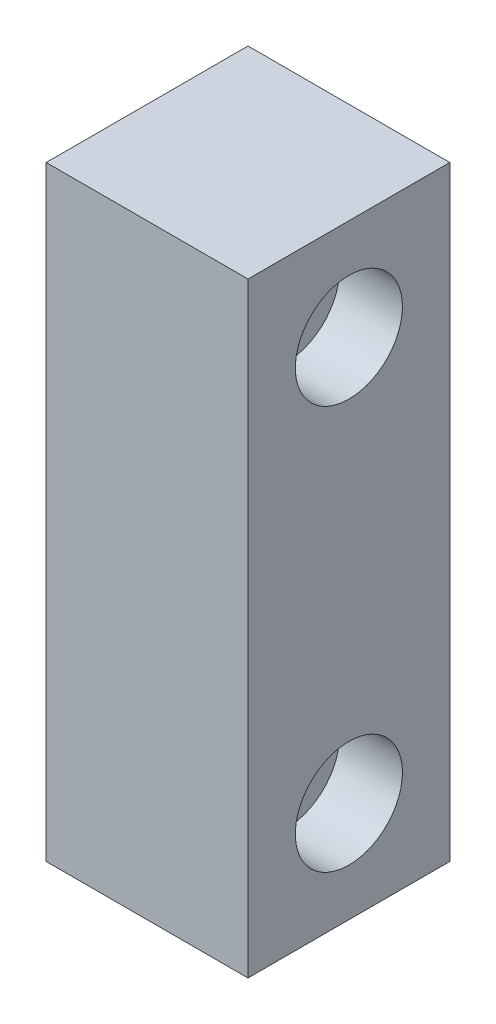
ISO-10303-21;
HEADER;
FILE_DESCRIPTION(('STEP AP214'),'2;1');
FILE_NAME('part.step','',(''),(''),'','','');
FILE_SCHEMA(('AUTOMOTIVE_DESIGN { 1 0 10303 214 1 1 1 1 }'));
ENDSEC;
DATA;
#1=APPLICATION_CONTEXT('core data for automotive mechanical design processes');
#2=APPLICATION_PROTOCOL_DEFINITION('international standard','automotive_design',2000,#1);
#3=PRODUCT_CONTEXT('',#1,'mechanical');
#4=PRODUCT('Part','Part','',(#3));
#5=PRODUCT_RELATED_PRODUCT_CATEGORY('part','',(#4));
#6=PRODUCT_DEFINITION_FORMATION('','',#4);
#7=PRODUCT_DEFINITION_CONTEXT('part definition',#1,'design');
#8=PRODUCT_DEFINITION('design','',#6,#7);
#9=PRODUCT_DEFINITION_SHAPE('','',#8);
#10=(LENGTH_UNIT() NAMED_UNIT(*) SI_UNIT(.MILLI.,.METRE.));
#11=(NAMED_UNIT(*) PLANE_ANGLE_UNIT() SI_UNIT($,.RADIAN.));
#12=(NAMED_UNIT(*) SI_UNIT($,.STERADIAN.) SOLID_ANGLE_UNIT());
#13=UNCERTAINTY_MEASURE_WITH_UNIT(LENGTH_MEASURE(1.E-05),#10,'distance_accuracy_value','');
#14=(GEOMETRIC_REPRESENTATION_CONTEXT(3) GLOBAL_UNCERTAINTY_ASSIGNED_CONTEXT((#13)) GLOBAL_UNIT_ASSIGNED_CONTEXT((#10,
#11,#12)) REPRESENTATION_CONTEXT('',''));
#15=CARTESIAN_POINT('',(0.,0.,0.));
#16=DIRECTION('',(0.,0.,1.));
#17=DIRECTION('',(1.,0.,0.));
#18=AXIS2_PLACEMENT_3D('',#15,#16,#17);
#19=CARTESIAN_POINT('',(-50.8,63.5,12.7));
#20=DIRECTION('',(1.,0.,0.));
#21=DIRECTION('',(0.,0.,-1.));
#22=AXIS2_PLACEMENT_3D('',#19,#20,#21);
#23=CYLINDRICAL_SURFACE('',#22,4.36880000000001);
#24=CARTESIAN_POINT('',(0.,63.5,12.7));
#25=DIRECTION('',(-1.,0.,0.));
#26=DIRECTION('',(0.,0.,1.));
#27=AXIS2_PLACEMENT_3D('',#24,#25,#26);
#28=CIRCLE('',#27,4.36880000000001);
#29=CARTESIAN_POINT('',(0.,63.5,17.0688));
#30=VERTEX_POINT('',#29);
#31=EDGE_CURVE('E124',#30,#30,#28,.T.);
#32=ORIENTED_EDGE('',*,*,#31,.T.);
#33=EDGE_LOOP('',(#32));
#34=FACE_BOUND('',#33,.T.);
#35=CARTESIAN_POINT('',(17.4752,63.5,12.7));
#36=DIRECTION('',(1.,0.,0.));
#37=DIRECTION('',(0.,0.,-1.));
#38=AXIS2_PLACEMENT_3D('',#35,#36,#37);
#39=CIRCLE('',#38,4.36880000000001);
#40=CARTESIAN_POINT('',(17.4752,63.5,8.33119999999999));
#41=VERTEX_POINT('',#40);
#42=EDGE_CURVE('E47',#41,#41,#39,.F.);
#43=ORIENTED_EDGE('',*,*,#42,.F.);
#44=EDGE_LOOP('',(#43));
#45=FACE_BOUND('',#44,.T.);
#46=ADVANCED_FACE('F43',(#34,#45),#23,.F.);
#47=CARTESIAN_POINT('',(-50.8,12.7,12.7));
#48=DIRECTION('',(1.,0.,0.));
#49=DIRECTION('',(0.,0.,-1.));
#50=AXIS2_PLACEMENT_3D('',#47,#48,#49);
#51=CYLINDRICAL_SURFACE('',#50,4.3688);
#52=CARTESIAN_POINT('',(0.,12.7,12.7));
#53=DIRECTION('',(-1.,0.,0.));
#54=DIRECTION('',(0.,0.,1.));
#55=AXIS2_PLACEMENT_3D('',#52,#53,#54);
#56=CIRCLE('',#55,4.3688);
#57=CARTESIAN_POINT('',(0.,12.7,17.0688));
#58=VERTEX_POINT('',#57);
#59=EDGE_CURVE('E113',#58,#58,#56,.T.);
#60=ORIENTED_EDGE('',*,*,#59,.T.);
#61=EDGE_LOOP('',(#60));
#62=FACE_BOUND('',#61,.T.);
#63=CARTESIAN_POINT('',(17.4752,12.7,12.7));
#64=DIRECTION('',(1.,0.,0.));
#65=DIRECTION('',(0.,0.,-1.));
#66=AXIS2_PLACEMENT_3D('',#63,#64,#65);
#67=CIRCLE('',#66,4.3688);
#68=CARTESIAN_POINT('',(17.4752,12.7,8.3312));
#69=VERTEX_POINT('',#68);
#70=EDGE_CURVE('E121',#69,#69,#67,.F.);
#71=ORIENTED_EDGE('',*,*,#70,.F.);
#72=EDGE_LOOP('',(#71));
#73=FACE_BOUND('',#72,.T.);
#74=ADVANCED_FACE('F172',(#62,#73),#51,.F.);
#75=CARTESIAN_POINT('',(25.4,0.,0.));
#76=DIRECTION('',(0.,1.,0.));
#77=DIRECTION('',(0.,0.,1.));
#78=AXIS2_PLACEMENT_3D('',#75,#76,#77);
#79=PLANE('',#78);
#80=DIRECTION('',(0.,0.,-1.));
#81=VECTOR('',#80,1.);
#82=CARTESIAN_POINT('',(0.,0.,0.));
#83=LINE('',#82,#81);
#84=CARTESIAN_POINT('',(0.,0.,25.4));
#85=VERTEX_POINT('',#84);
#86=CARTESIAN_POINT('',(0.,0.,0.));
#87=VERTEX_POINT('',#86);
#88=EDGE_CURVE('E110',#85,#87,#83,.T.);
#89=ORIENTED_EDGE('',*,*,#88,.T.);
#90=DIRECTION('',(-1.,0.,0.));
#91=VECTOR('',#90,1.);
#92=CARTESIAN_POINT('',(25.4,0.,0.));
#93=LINE('',#92,#91);
#94=CARTESIAN_POINT('',(25.4,0.,0.));
#95=VERTEX_POINT('',#94);
#96=EDGE_CURVE('E11',#95,#87,#93,.T.);
#97=ORIENTED_EDGE('',*,*,#96,.F.);
#98=DIRECTION('',(0.,0.,-1.));
#99=VECTOR('',#98,1.);
#100=CARTESIAN_POINT('',(25.4,0.,0.));
#101=LINE('',#100,#99);
#102=CARTESIAN_POINT('',(25.4,0.,25.4));
#103=VERTEX_POINT('',#102);
#104=EDGE_CURVE('E97',#103,#95,#101,.T.);
#105=ORIENTED_EDGE('',*,*,#104,.F.);
#106=DIRECTION('',(-1.,0.,0.));
#107=VECTOR('',#106,1.);
#108=CARTESIAN_POINT('',(25.4,0.,25.4));
#109=LINE('',#108,#107);
#110=EDGE_CURVE('E106',#103,#85,#109,.T.);
#111=ORIENTED_EDGE('',*,*,#110,.T.);
#112=EDGE_LOOP('',(#89,#97,#105,#111));
#113=FACE_BOUND('',#112,.T.);
#114=ADVANCED_FACE('F45',(#113),#79,.F.);
#115=CARTESIAN_POINT('',(25.4,0.,0.));
#116=DIRECTION('',(0.,0.,1.));
#117=DIRECTION('',(1.,0.,0.));
#118=AXIS2_PLACEMENT_3D('',#115,#116,#117);
#119=PLANE('',#118);
#120=DIRECTION('',(0.,1.,0.));
#121=VECTOR('',#120,1.);
#122=CARTESIAN_POINT('',(0.,0.,0.));
#123=LINE('',#122,#121);
#124=CARTESIAN_POINT('',(0.,76.2,0.));
#125=VERTEX_POINT('',#124);
#126=EDGE_CURVE('E101',#87,#125,#123,.T.);
#127=ORIENTED_EDGE('',*,*,#126,.T.);
#128=DIRECTION('',(-1.,0.,0.));
#129=VECTOR('',#128,1.);
#130=CARTESIAN_POINT('',(25.4,76.2,0.));
#131=LINE('',#130,#129);
#132=CARTESIAN_POINT('',(25.4,76.2,0.));
#133=VERTEX_POINT('',#132);
#134=EDGE_CURVE('E53',#133,#125,#131,.T.);
#135=ORIENTED_EDGE('',*,*,#134,.F.);
#136=DIRECTION('',(0.,1.,0.));
#137=VECTOR('',#136,1.);
#138=CARTESIAN_POINT('',(25.4,0.,0.));
#139=LINE('',#138,#137);
#140=EDGE_CURVE('E92',#95,#133,#139,.T.);
#141=ORIENTED_EDGE('',*,*,#140,.F.);
#142=ORIENTED_EDGE('',*,*,#96,.T.);
#143=EDGE_LOOP('',(#127,#135,#141,#142));
#144=FACE_BOUND('',#143,.T.);
#145=ADVANCED_FACE('F100',(#144),#119,.F.);
#146=CARTESIAN_POINT('',(25.4,76.2,0.));
#147=DIRECTION('',(0.,-1.,0.));
#148=DIRECTION('',(0.,0.,-1.));
#149=AXIS2_PLACEMENT_3D('',#146,#147,#148);
#150=PLANE('',#149);
#151=DIRECTION('',(0.,0.,1.));
#152=VECTOR('',#151,1.);
#153=CARTESIAN_POINT('',(0.,76.2,0.));
#154=LINE('',#153,#152);
#155=CARTESIAN_POINT('',(0.,76.2,25.4));
#156=VERTEX_POINT('',#155);
#157=EDGE_CURVE('E79',#125,#156,#154,.T.);
#158=ORIENTED_EDGE('',*,*,#157,.T.);
#159=DIRECTION('',(-1.,0.,0.));
#160=VECTOR('',#159,1.);
#161=CARTESIAN_POINT('',(25.4,76.2,25.4));
#162=LINE('',#161,#160);
#163=CARTESIAN_POINT('',(25.4,76.2,25.4));
#164=VERTEX_POINT('',#163);
#165=EDGE_CURVE('E102',#164,#156,#162,.T.);
#166=ORIENTED_EDGE('',*,*,#165,.F.);
#167=DIRECTION('',(0.,0.,1.));
#168=VECTOR('',#167,1.);
#169=CARTESIAN_POINT('',(25.4,76.2,0.));
#170=LINE('',#169,#168);
#171=EDGE_CURVE('E95',#133,#164,#170,.T.);
#172=ORIENTED_EDGE('',*,*,#171,.F.);
#173=ORIENTED_EDGE('',*,*,#134,.T.);
#174=EDGE_LOOP('',(#158,#166,#172,#173));
#175=FACE_BOUND('',#174,.T.);
#176=ADVANCED_FACE('F104',(#175),#150,.F.);
#177=CARTESIAN_POINT('',(25.4,0.,25.4));
#178=DIRECTION('',(0.,0.,-1.));
#179=DIRECTION('',(-1.,0.,0.));
#180=AXIS2_PLACEMENT_3D('',#177,#178,#179);
#181=PLANE('',#180);
#182=DIRECTION('',(0.,-1.,0.));
#183=VECTOR('',#182,1.);
#184=CARTESIAN_POINT('',(0.,0.,25.4));
#185=LINE('',#184,#183);
#186=EDGE_CURVE('E85',#156,#85,#185,.T.);
#187=ORIENTED_EDGE('',*,*,#186,.T.);
#188=ORIENTED_EDGE('',*,*,#110,.F.);
#189=DIRECTION('',(0.,-1.,0.));
#190=VECTOR('',#189,1.);
#191=CARTESIAN_POINT('',(25.4,0.,25.4));
#192=LINE('',#191,#190);
#193=EDGE_CURVE('E62',#164,#103,#192,.T.);
#194=ORIENTED_EDGE('',*,*,#193,.F.);
#195=ORIENTED_EDGE('',*,*,#165,.T.);
#196=EDGE_LOOP('',(#187,#188,#194,#195));
#197=FACE_BOUND('',#196,.T.);
#198=ADVANCED_FACE('F158',(#197),#181,.F.);
#199=CARTESIAN_POINT('',(25.4,0.,0.));
#200=DIRECTION('',(-1.,0.,0.));
#201=DIRECTION('',(0.,0.,1.));
#202=AXIS2_PLACEMENT_3D('',#199,#200,#201);
#203=PLANE('',#202);
#204=CARTESIAN_POINT('',(25.4,63.5,12.7));
#205=DIRECTION('',(1.,0.,0.));
#206=DIRECTION('',(0.,0.,-1.));
#207=AXIS2_PLACEMENT_3D('',#204,#205,#206);
#208=CIRCLE('',#207,6.74370000000001);
#209=CARTESIAN_POINT('',(25.4,63.5,5.95629999999999));
#210=VERTEX_POINT('',#209);
#211=EDGE_CURVE('E136',#210,#210,#208,.T.);
#212=ORIENTED_EDGE('',*,*,#211,.F.);
#213=EDGE_LOOP('',(#212));
#214=FACE_BOUND('',#213,.T.);
#215=CARTESIAN_POINT('',(25.4,12.7,12.7));
#216=DIRECTION('',(1.,0.,0.));
#217=DIRECTION('',(0.,0.,-1.));
#218=AXIS2_PLACEMENT_3D('',#215,#216,#217);
#219=CIRCLE('',#218,6.7437);
#220=CARTESIAN_POINT('',(25.4,12.7,5.9563));
#221=VERTEX_POINT('',#220);
#222=EDGE_CURVE('E126',#221,#221,#219,.T.);
#223=ORIENTED_EDGE('',*,*,#222,.F.);
#224=EDGE_LOOP('',(#223));
#225=FACE_BOUND('',#224,.T.);
#226=ORIENTED_EDGE('',*,*,#104,.T.);
#227=ORIENTED_EDGE('',*,*,#140,.T.);
#228=ORIENTED_EDGE('',*,*,#171,.T.);
#229=ORIENTED_EDGE('',*,*,#193,.T.);
#230=EDGE_LOOP('',(#226,#227,#228,#229));
#231=FACE_BOUND('',#230,.T.);
#232=ADVANCED_FACE('F93',(#214,#225,#231),#203,.F.);
#233=CARTESIAN_POINT('',(0.,0.,0.));
#234=DIRECTION('',(-1.,0.,0.));
#235=DIRECTION('',(0.,0.,1.));
#236=AXIS2_PLACEMENT_3D('',#233,#234,#235);
#237=PLANE('',#236);
#238=ORIENTED_EDGE('',*,*,#31,.F.);
#239=EDGE_LOOP('',(#238));
#240=FACE_BOUND('',#239,.T.);
#241=ORIENTED_EDGE('',*,*,#59,.F.);
#242=EDGE_LOOP('',(#241));
#243=FACE_BOUND('',#242,.T.);
#244=ORIENTED_EDGE('',*,*,#88,.F.);
#245=ORIENTED_EDGE('',*,*,#186,.F.);
#246=ORIENTED_EDGE('',*,*,#157,.F.);
#247=ORIENTED_EDGE('',*,*,#126,.F.);
#248=EDGE_LOOP('',(#244,#245,#246,#247));
#249=FACE_BOUND('',#248,.T.);
#250=ADVANCED_FACE('F157',(#240,#243,#249),#237,.T.);
#251=CARTESIAN_POINT('',(17.4752,12.7,12.7));
#252=DIRECTION('',(1.,0.,0.));
#253=DIRECTION('',(0.,0.,-1.));
#254=AXIS2_PLACEMENT_3D('',#251,#252,#253);
#255=PLANE('',#254);
#256=CARTESIAN_POINT('',(17.4752,12.7,12.7));
#257=DIRECTION('',(1.,0.,0.));
#258=DIRECTION('',(0.,0.,-1.));
#259=AXIS2_PLACEMENT_3D('',#256,#257,#258);
#260=CIRCLE('',#259,6.7437);
#261=CARTESIAN_POINT('',(17.4752,12.7,5.9563));
#262=VERTEX_POINT('',#261);
#263=EDGE_CURVE('E123',#262,#262,#260,.T.);
#264=ORIENTED_EDGE('',*,*,#263,.T.);
#265=EDGE_LOOP('',(#264));
#266=FACE_BOUND('',#265,.T.);
#267=ORIENTED_EDGE('',*,*,#70,.T.);
#268=EDGE_LOOP('',(#267));
#269=FACE_BOUND('',#268,.T.);
#270=ADVANCED_FACE('F146',(#266,#269),#255,.T.);
#271=CARTESIAN_POINT('',(17.4752,12.7,12.7));
#272=DIRECTION('',(1.,0.,0.));
#273=DIRECTION('',(0.,0.,-1.));
#274=AXIS2_PLACEMENT_3D('',#271,#272,#273);
#275=CYLINDRICAL_SURFACE('',#274,6.7437);
#276=ORIENTED_EDGE('',*,*,#263,.F.);
#277=EDGE_LOOP('',(#276));
#278=FACE_BOUND('',#277,.T.);
#279=ORIENTED_EDGE('',*,*,#222,.T.);
#280=EDGE_LOOP('',(#279));
#281=FACE_BOUND('',#280,.T.);
#282=ADVANCED_FACE('F149',(#278,#281),#275,.F.);
#283=CARTESIAN_POINT('',(17.4752,63.5,12.7));
#284=DIRECTION('',(1.,0.,0.));
#285=DIRECTION('',(0.,0.,-1.));
#286=AXIS2_PLACEMENT_3D('',#283,#284,#285);
#287=PLANE('',#286);
#288=CARTESIAN_POINT('',(17.4752,63.5,12.7));
#289=DIRECTION('',(1.,0.,0.));
#290=DIRECTION('',(0.,0.,-1.));
#291=AXIS2_PLACEMENT_3D('',#288,#289,#290);
#292=CIRCLE('',#291,6.74370000000001);
#293=CARTESIAN_POINT('',(17.4752,63.5,5.95629999999999));
#294=VERTEX_POINT('',#293);
#295=EDGE_CURVE('E132',#294,#294,#292,.T.);
#296=ORIENTED_EDGE('',*,*,#295,.T.);
#297=EDGE_LOOP('',(#296));
#298=FACE_BOUND('',#297,.T.);
#299=ORIENTED_EDGE('',*,*,#42,.T.);
#300=EDGE_LOOP('',(#299));
#301=FACE_BOUND('',#300,.T.);
#302=ADVANCED_FACE('F152',(#298,#301),#287,.T.);
#303=CARTESIAN_POINT('',(17.4752,63.5,12.7));
#304=DIRECTION('',(1.,0.,0.));
#305=DIRECTION('',(0.,0.,-1.));
#306=AXIS2_PLACEMENT_3D('',#303,#304,#305);
#307=CYLINDRICAL_SURFACE('',#306,6.74370000000001);
#308=ORIENTED_EDGE('',*,*,#295,.F.);
#309=EDGE_LOOP('',(#308));
#310=FACE_BOUND('',#309,.T.);
#311=ORIENTED_EDGE('',*,*,#211,.T.);
#312=EDGE_LOOP('',(#311));
#313=FACE_BOUND('',#312,.T.);
#314=ADVANCED_FACE('F181',(#310,#313),#307,.F.);
#315=CLOSED_SHELL('',(#46,#74,#114,#145,#176,#198,#232,#250,#270,#282,#302,#314));
#316=MANIFOLD_SOLID_BREP('B2',#315);
#317=ADVANCED_BREP_SHAPE_REPRESENTATION('',(#18,#316),#14);
#318=SHAPE_DEFINITION_REPRESENTATION(#9,#317);
ENDSEC;
END-ISO-10303-21;
